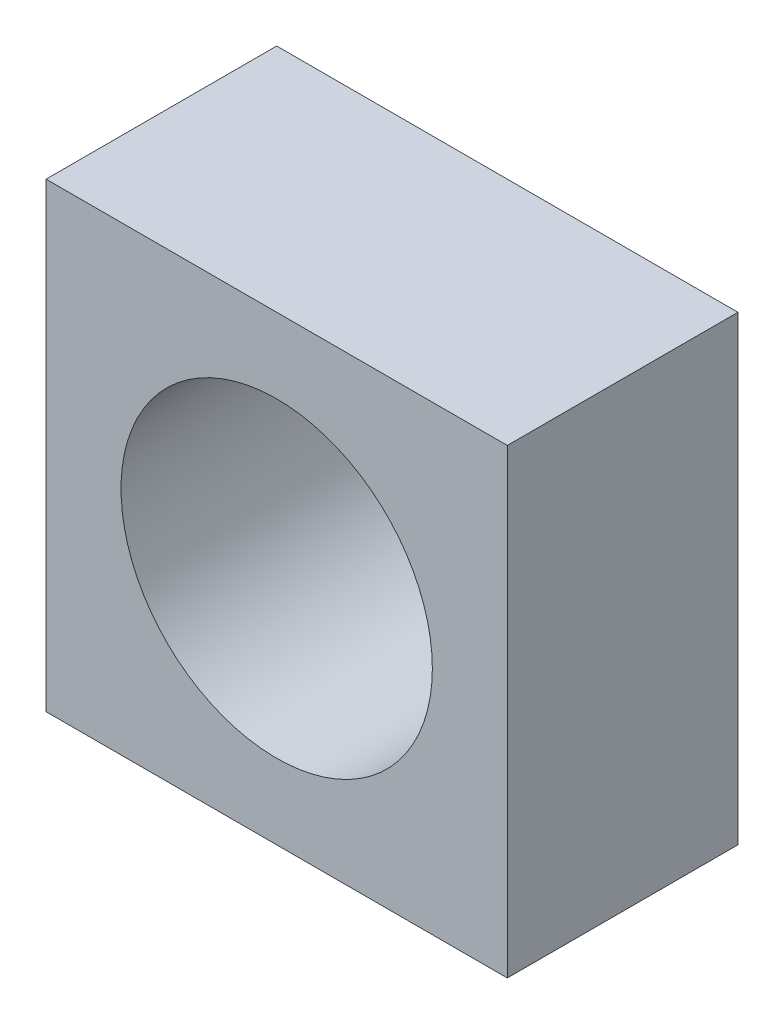
ISO-10303-21;
HEADER;
FILE_DESCRIPTION(('STEP AP214'),'2;1');
FILE_NAME('part.step','',(''),(''),'','','');
FILE_SCHEMA(('AUTOMOTIVE_DESIGN { 1 0 10303 214 1 1 1 1 }'));
ENDSEC;
DATA;
#1=APPLICATION_CONTEXT('core data for automotive mechanical design processes');
#2=APPLICATION_PROTOCOL_DEFINITION('international standard','automotive_design',2000,#1);
#3=PRODUCT_CONTEXT('',#1,'mechanical');
#4=PRODUCT('Part','Part','',(#3));
#5=PRODUCT_RELATED_PRODUCT_CATEGORY('part','',(#4));
#6=PRODUCT_DEFINITION_FORMATION('','',#4);
#7=PRODUCT_DEFINITION_CONTEXT('part definition',#1,'design');
#8=PRODUCT_DEFINITION('design','',#6,#7);
#9=PRODUCT_DEFINITION_SHAPE('','',#8);
#10=(LENGTH_UNIT() NAMED_UNIT(*) SI_UNIT(.MILLI.,.METRE.));
#11=(NAMED_UNIT(*) PLANE_ANGLE_UNIT() SI_UNIT($,.RADIAN.));
#12=(NAMED_UNIT(*) SI_UNIT($,.STERADIAN.) SOLID_ANGLE_UNIT());
#13=UNCERTAINTY_MEASURE_WITH_UNIT(LENGTH_MEASURE(1.E-05),#10,'distance_accuracy_value','');
#14=(GEOMETRIC_REPRESENTATION_CONTEXT(3) GLOBAL_UNCERTAINTY_ASSIGNED_CONTEXT((#13)) GLOBAL_UNIT_ASSIGNED_CONTEXT((#10,
#11,#12)) REPRESENTATION_CONTEXT('',''));
#15=CARTESIAN_POINT('',(0.,0.,0.));
#16=DIRECTION('',(0.,0.,1.));
#17=DIRECTION('',(1.,0.,0.));
#18=AXIS2_PLACEMENT_3D('',#15,#16,#17);
#19=CARTESIAN_POINT('',(-4.,-4.,4.));
#20=DIRECTION('',(1.,0.,0.));
#21=DIRECTION('',(0.,0.,-1.));
#22=AXIS2_PLACEMENT_3D('',#19,#20,#21);
#23=PLANE('',#22);
#24=DIRECTION('',(0.,-1.,0.));
#25=VECTOR('',#24,1.);
#26=CARTESIAN_POINT('',(-4.,-4.,0.));
#27=LINE('',#26,#25);
#28=CARTESIAN_POINT('',(-4.,4.,0.));
#29=VERTEX_POINT('',#28);
#30=CARTESIAN_POINT('',(-4.,-4.,0.));
#31=VERTEX_POINT('',#30);
#32=EDGE_CURVE('E102',#29,#31,#27,.T.);
#33=ORIENTED_EDGE('',*,*,#32,.T.);
#34=DIRECTION('',(0.,0.,-1.));
#35=VECTOR('',#34,1.);
#36=CARTESIAN_POINT('',(-4.,-4.,4.));
#37=LINE('',#36,#35);
#38=CARTESIAN_POINT('',(-4.,-4.,4.));
#39=VERTEX_POINT('',#38);
#40=EDGE_CURVE('E11',#39,#31,#37,.T.);
#41=ORIENTED_EDGE('',*,*,#40,.F.);
#42=DIRECTION('',(0.,-1.,0.));
#43=VECTOR('',#42,1.);
#44=CARTESIAN_POINT('',(-4.,-4.,4.));
#45=LINE('',#44,#43);
#46=CARTESIAN_POINT('',(-4.,4.,4.));
#47=VERTEX_POINT('',#46);
#48=EDGE_CURVE('E90',#47,#39,#45,.T.);
#49=ORIENTED_EDGE('',*,*,#48,.F.);
#50=DIRECTION('',(0.,0.,-1.));
#51=VECTOR('',#50,1.);
#52=CARTESIAN_POINT('',(-4.,4.,4.));
#53=LINE('',#52,#51);
#54=EDGE_CURVE('E98',#47,#29,#53,.T.);
#55=ORIENTED_EDGE('',*,*,#54,.T.);
#56=EDGE_LOOP('',(#33,#41,#49,#55));
#57=FACE_BOUND('',#56,.T.);
#58=ADVANCED_FACE('F39',(#57),#23,.F.);
#59=CARTESIAN_POINT('',(-4.,-4.,4.));
#60=DIRECTION('',(0.,1.,0.));
#61=DIRECTION('',(0.,0.,1.));
#62=AXIS2_PLACEMENT_3D('',#59,#60,#61);
#63=PLANE('',#62);
#64=DIRECTION('',(1.,0.,0.));
#65=VECTOR('',#64,1.);
#66=CARTESIAN_POINT('',(-4.,-4.,0.));
#67=LINE('',#66,#65);
#68=CARTESIAN_POINT('',(4.,-4.,0.));
#69=VERTEX_POINT('',#68);
#70=EDGE_CURVE('E94',#31,#69,#67,.T.);
#71=ORIENTED_EDGE('',*,*,#70,.T.);
#72=DIRECTION('',(0.,0.,-1.));
#73=VECTOR('',#72,1.);
#74=CARTESIAN_POINT('',(4.,-4.,4.));
#75=LINE('',#74,#73);
#76=CARTESIAN_POINT('',(4.,-4.,4.));
#77=VERTEX_POINT('',#76);
#78=EDGE_CURVE('E47',#77,#69,#75,.T.);
#79=ORIENTED_EDGE('',*,*,#78,.F.);
#80=DIRECTION('',(1.,0.,0.));
#81=VECTOR('',#80,1.);
#82=CARTESIAN_POINT('',(-4.,-4.,4.));
#83=LINE('',#82,#81);
#84=EDGE_CURVE('E85',#39,#77,#83,.T.);
#85=ORIENTED_EDGE('',*,*,#84,.F.);
#86=ORIENTED_EDGE('',*,*,#40,.T.);
#87=EDGE_LOOP('',(#71,#79,#85,#86));
#88=FACE_BOUND('',#87,.T.);
#89=ADVANCED_FACE('F93',(#88),#63,.F.);
#90=CARTESIAN_POINT('',(4.,-4.,4.));
#91=DIRECTION('',(-1.,0.,0.));
#92=DIRECTION('',(0.,0.,1.));
#93=AXIS2_PLACEMENT_3D('',#90,#91,#92);
#94=PLANE('',#93);
#95=DIRECTION('',(0.,1.,0.));
#96=VECTOR('',#95,1.);
#97=CARTESIAN_POINT('',(4.,-4.,0.));
#98=LINE('',#97,#96);
#99=CARTESIAN_POINT('',(4.,4.,0.));
#100=VERTEX_POINT('',#99);
#101=EDGE_CURVE('E72',#69,#100,#98,.T.);
#102=ORIENTED_EDGE('',*,*,#101,.T.);
#103=DIRECTION('',(0.,0.,-1.));
#104=VECTOR('',#103,1.);
#105=CARTESIAN_POINT('',(4.,4.,4.));
#106=LINE('',#105,#104);
#107=CARTESIAN_POINT('',(4.,4.,4.));
#108=VERTEX_POINT('',#107);
#109=EDGE_CURVE('E95',#108,#100,#106,.T.);
#110=ORIENTED_EDGE('',*,*,#109,.F.);
#111=DIRECTION('',(0.,1.,0.));
#112=VECTOR('',#111,1.);
#113=CARTESIAN_POINT('',(4.,-4.,4.));
#114=LINE('',#113,#112);
#115=EDGE_CURVE('E88',#77,#108,#114,.T.);
#116=ORIENTED_EDGE('',*,*,#115,.F.);
#117=ORIENTED_EDGE('',*,*,#78,.T.);
#118=EDGE_LOOP('',(#102,#110,#116,#117));
#119=FACE_BOUND('',#118,.T.);
#120=ADVANCED_FACE('F96',(#119),#94,.F.);
#121=CARTESIAN_POINT('',(-4.,4.,4.));
#122=DIRECTION('',(0.,-1.,0.));
#123=DIRECTION('',(0.,0.,-1.));
#124=AXIS2_PLACEMENT_3D('',#121,#122,#123);
#125=PLANE('',#124);
#126=DIRECTION('',(-1.,0.,0.));
#127=VECTOR('',#126,1.);
#128=CARTESIAN_POINT('',(-4.,4.,0.));
#129=LINE('',#128,#127);
#130=EDGE_CURVE('E78',#100,#29,#129,.T.);
#131=ORIENTED_EDGE('',*,*,#130,.T.);
#132=ORIENTED_EDGE('',*,*,#54,.F.);
#133=DIRECTION('',(-1.,0.,0.));
#134=VECTOR('',#133,1.);
#135=CARTESIAN_POINT('',(-4.,4.,4.));
#136=LINE('',#135,#134);
#137=EDGE_CURVE('E55',#108,#47,#136,.T.);
#138=ORIENTED_EDGE('',*,*,#137,.F.);
#139=ORIENTED_EDGE('',*,*,#109,.T.);
#140=EDGE_LOOP('',(#131,#132,#138,#139));
#141=FACE_BOUND('',#140,.T.);
#142=ADVANCED_FACE('F110',(#141),#125,.F.);
#143=CARTESIAN_POINT('',(0.,0.,4.));
#144=DIRECTION('',(0.,0.,-1.));
#145=DIRECTION('',(-1.,0.,0.));
#146=AXIS2_PLACEMENT_3D('',#143,#144,#145);
#147=PLANE('',#146);
#148=CARTESIAN_POINT('',(0.,0.,4.));
#149=DIRECTION('',(0.,0.,1.));
#150=DIRECTION('',(1.,0.,0.));
#151=AXIS2_PLACEMENT_3D('',#148,#149,#150);
#152=CIRCLE('',#151,2.7);
#153=CARTESIAN_POINT('',(2.7,0.,4.));
#154=VERTEX_POINT('',#153);
#155=EDGE_CURVE('E105',#154,#154,#152,.T.);
#156=ORIENTED_EDGE('',*,*,#155,.F.);
#157=EDGE_LOOP('',(#156));
#158=FACE_BOUND('',#157,.T.);
#159=ORIENTED_EDGE('',*,*,#48,.T.);
#160=ORIENTED_EDGE('',*,*,#84,.T.);
#161=ORIENTED_EDGE('',*,*,#115,.T.);
#162=ORIENTED_EDGE('',*,*,#137,.T.);
#163=EDGE_LOOP('',(#159,#160,#161,#162));
#164=FACE_BOUND('',#163,.T.);
#165=ADVANCED_FACE('F86',(#158,#164),#147,.F.);
#166=CARTESIAN_POINT('',(0.,0.,0.));
#167=DIRECTION('',(0.,0.,-1.));
#168=DIRECTION('',(-1.,0.,0.));
#169=AXIS2_PLACEMENT_3D('',#166,#167,#168);
#170=PLANE('',#169);
#171=CARTESIAN_POINT('',(0.,0.,0.));
#172=DIRECTION('',(0.,0.,1.));
#173=DIRECTION('',(1.,0.,0.));
#174=AXIS2_PLACEMENT_3D('',#171,#172,#173);
#175=CIRCLE('',#174,2.7);
#176=CARTESIAN_POINT('',(2.7,0.,0.));
#177=VERTEX_POINT('',#176);
#178=EDGE_CURVE('E116',#177,#177,#175,.T.);
#179=ORIENTED_EDGE('',*,*,#178,.T.);
#180=EDGE_LOOP('',(#179));
#181=FACE_BOUND('',#180,.T.);
#182=ORIENTED_EDGE('',*,*,#32,.F.);
#183=ORIENTED_EDGE('',*,*,#130,.F.);
#184=ORIENTED_EDGE('',*,*,#101,.F.);
#185=ORIENTED_EDGE('',*,*,#70,.F.);
#186=EDGE_LOOP('',(#182,#183,#184,#185));
#187=FACE_BOUND('',#186,.T.);
#188=ADVANCED_FACE('F113',(#181,#187),#170,.T.);
#189=CARTESIAN_POINT('',(0.,0.,4.));
#190=DIRECTION('',(0.,0.,-1.));
#191=DIRECTION('',(-1.,0.,0.));
#192=AXIS2_PLACEMENT_3D('',#189,#190,#191);
#193=CYLINDRICAL_SURFACE('',#192,2.7);
#194=ORIENTED_EDGE('',*,*,#155,.T.);
#195=EDGE_LOOP('',(#194));
#196=FACE_BOUND('',#195,.T.);
#197=ORIENTED_EDGE('',*,*,#178,.F.);
#198=EDGE_LOOP('',(#197));
#199=FACE_BOUND('',#198,.T.);
#200=ADVANCED_FACE('F122',(#196,#199),#193,.F.);
#201=CLOSED_SHELL('',(#58,#89,#120,#142,#165,#188,#200));
#202=MANIFOLD_SOLID_BREP('B2',#201);
#203=ADVANCED_BREP_SHAPE_REPRESENTATION('',(#18,#202),#14);
#204=SHAPE_DEFINITION_REPRESENTATION(#9,#203);
ENDSEC;
END-ISO-10303-21;
